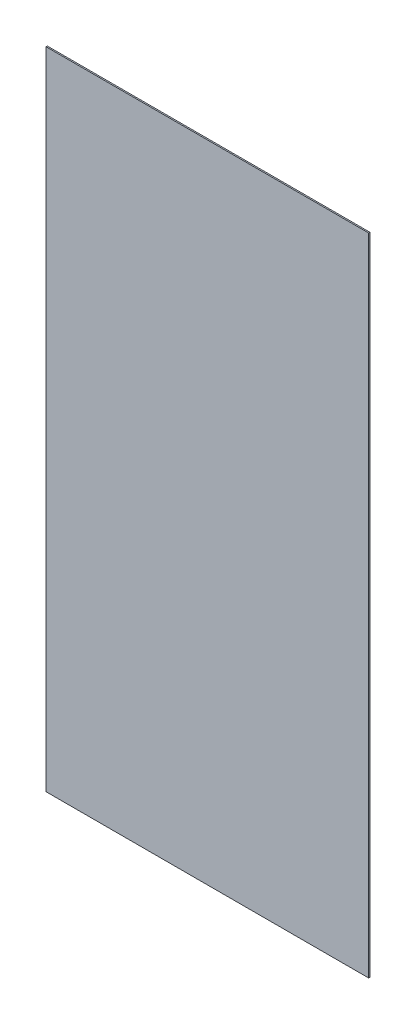
ISO-10303-21;
HEADER;
FILE_DESCRIPTION(('STEP AP214'),'2;1');
FILE_NAME('part.step','',(''),(''),'','','');
FILE_SCHEMA(('AUTOMOTIVE_DESIGN { 1 0 10303 214 1 1 1 1 }'));
ENDSEC;
DATA;
#1=APPLICATION_CONTEXT('core data for automotive mechanical design processes');
#2=APPLICATION_PROTOCOL_DEFINITION('international standard','automotive_design',2000,#1);
#3=PRODUCT_CONTEXT('',#1,'mechanical');
#4=PRODUCT('Part','Part','',(#3));
#5=PRODUCT_RELATED_PRODUCT_CATEGORY('part','',(#4));
#6=PRODUCT_DEFINITION_FORMATION('','',#4);
#7=PRODUCT_DEFINITION_CONTEXT('part definition',#1,'design');
#8=PRODUCT_DEFINITION('design','',#6,#7);
#9=PRODUCT_DEFINITION_SHAPE('','',#8);
#10=(LENGTH_UNIT() NAMED_UNIT(*) SI_UNIT(.MILLI.,.METRE.));
#11=(NAMED_UNIT(*) PLANE_ANGLE_UNIT() SI_UNIT($,.RADIAN.));
#12=(NAMED_UNIT(*) SI_UNIT($,.STERADIAN.) SOLID_ANGLE_UNIT());
#13=UNCERTAINTY_MEASURE_WITH_UNIT(LENGTH_MEASURE(1.E-05),#10,'distance_accuracy_value','');
#14=(GEOMETRIC_REPRESENTATION_CONTEXT(3) GLOBAL_UNCERTAINTY_ASSIGNED_CONTEXT((#13)) GLOBAL_UNIT_ASSIGNED_CONTEXT((#10,
#11,#12)) REPRESENTATION_CONTEXT('',''));
#15=CARTESIAN_POINT('',(0.,0.,0.));
#16=DIRECTION('',(0.,0.,1.));
#17=DIRECTION('',(1.,0.,0.));
#18=AXIS2_PLACEMENT_3D('',#15,#16,#17);
#19=CARTESIAN_POINT('',(1250.,2500.,10.));
#20=DIRECTION('',(-1.,0.,0.));
#21=DIRECTION('',(0.,-1.,0.));
#22=AXIS2_PLACEMENT_3D('',#19,#20,#21);
#23=PLANE('',#22);
#24=DIRECTION('',(0.,1.,0.));
#25=VECTOR('',#24,1.);
#26=CARTESIAN_POINT('',(1250.,2500.,0.));
#27=LINE('',#26,#25);
#28=CARTESIAN_POINT('',(1250.,-2500.,0.));
#29=VERTEX_POINT('',#28);
#30=CARTESIAN_POINT('',(1250.,2500.,0.));
#31=VERTEX_POINT('',#30);
#32=EDGE_CURVE('E107',#29,#31,#27,.T.);
#33=ORIENTED_EDGE('',*,*,#32,.T.);
#34=DIRECTION('',(0.,0.,-1.));
#35=VECTOR('',#34,1.);
#36=CARTESIAN_POINT('',(1250.,2500.,10.));
#37=LINE('',#36,#35);
#38=CARTESIAN_POINT('',(1250.,2500.,10.));
#39=VERTEX_POINT('',#38);
#40=EDGE_CURVE('E11',#39,#31,#37,.T.);
#41=ORIENTED_EDGE('',*,*,#40,.F.);
#42=DIRECTION('',(0.,1.,0.));
#43=VECTOR('',#42,1.);
#44=CARTESIAN_POINT('',(1250.,2500.,10.));
#45=LINE('',#44,#43);
#46=CARTESIAN_POINT('',(1250.,-2500.,10.));
#47=VERTEX_POINT('',#46);
#48=EDGE_CURVE('E91',#47,#39,#45,.T.);
#49=ORIENTED_EDGE('',*,*,#48,.F.);
#50=DIRECTION('',(0.,0.,-1.));
#51=VECTOR('',#50,1.);
#52=CARTESIAN_POINT('',(1250.,-2500.,10.));
#53=LINE('',#52,#51);
#54=EDGE_CURVE('E103',#47,#29,#53,.T.);
#55=ORIENTED_EDGE('',*,*,#54,.T.);
#56=EDGE_LOOP('',(#33,#41,#49,#55));
#57=FACE_BOUND('',#56,.T.);
#58=ADVANCED_FACE('F39',(#57),#23,.F.);
#59=CARTESIAN_POINT('',(-1250.,2500.,10.));
#60=DIRECTION('',(0.,-1.,0.));
#61=DIRECTION('',(0.,0.,-1.));
#62=AXIS2_PLACEMENT_3D('',#59,#60,#61);
#63=PLANE('',#62);
#64=DIRECTION('',(-1.,0.,0.));
#65=VECTOR('',#64,1.);
#66=CARTESIAN_POINT('',(-1250.,2500.,0.));
#67=LINE('',#66,#65);
#68=CARTESIAN_POINT('',(-1250.,2500.,0.));
#69=VERTEX_POINT('',#68);
#70=EDGE_CURVE('E96',#31,#69,#67,.T.);
#71=ORIENTED_EDGE('',*,*,#70,.T.);
#72=DIRECTION('',(0.,0.,-1.));
#73=VECTOR('',#72,1.);
#74=CARTESIAN_POINT('',(-1250.,2500.,10.));
#75=LINE('',#74,#73);
#76=CARTESIAN_POINT('',(-1250.,2500.,10.));
#77=VERTEX_POINT('',#76);
#78=EDGE_CURVE('E48',#77,#69,#75,.T.);
#79=ORIENTED_EDGE('',*,*,#78,.F.);
#80=DIRECTION('',(-1.,0.,0.));
#81=VECTOR('',#80,1.);
#82=CARTESIAN_POINT('',(-1250.,2500.,10.));
#83=LINE('',#82,#81);
#84=EDGE_CURVE('E86',#39,#77,#83,.T.);
#85=ORIENTED_EDGE('',*,*,#84,.F.);
#86=ORIENTED_EDGE('',*,*,#40,.T.);
#87=EDGE_LOOP('',(#71,#79,#85,#86));
#88=FACE_BOUND('',#87,.T.);
#89=ADVANCED_FACE('F95',(#88),#63,.F.);
#90=CARTESIAN_POINT('',(-1250.,2500.,10.));
#91=DIRECTION('',(1.,0.,0.));
#92=DIRECTION('',(0.,1.,0.));
#93=AXIS2_PLACEMENT_3D('',#90,#91,#92);
#94=PLANE('',#93);
#95=DIRECTION('',(0.,-1.,0.));
#96=VECTOR('',#95,1.);
#97=CARTESIAN_POINT('',(-1250.,2500.,0.));
#98=LINE('',#97,#96);
#99=CARTESIAN_POINT('',(-1250.,-2500.,0.));
#100=VERTEX_POINT('',#99);
#101=EDGE_CURVE('E73',#69,#100,#98,.T.);
#102=ORIENTED_EDGE('',*,*,#101,.T.);
#103=DIRECTION('',(0.,0.,-1.));
#104=VECTOR('',#103,1.);
#105=CARTESIAN_POINT('',(-1250.,-2500.,10.));
#106=LINE('',#105,#104);
#107=CARTESIAN_POINT('',(-1250.,-2500.,10.));
#108=VERTEX_POINT('',#107);
#109=EDGE_CURVE('E98',#108,#100,#106,.T.);
#110=ORIENTED_EDGE('',*,*,#109,.F.);
#111=DIRECTION('',(0.,-1.,0.));
#112=VECTOR('',#111,1.);
#113=CARTESIAN_POINT('',(-1250.,2500.,10.));
#114=LINE('',#113,#112);
#115=EDGE_CURVE('E89',#77,#108,#114,.T.);
#116=ORIENTED_EDGE('',*,*,#115,.F.);
#117=ORIENTED_EDGE('',*,*,#78,.T.);
#118=EDGE_LOOP('',(#102,#110,#116,#117));
#119=FACE_BOUND('',#118,.T.);
#120=ADVANCED_FACE('F99',(#119),#94,.F.);
#121=CARTESIAN_POINT('',(-1250.,-2500.,10.));
#122=DIRECTION('',(0.,1.,0.));
#123=DIRECTION('',(0.,0.,1.));
#124=AXIS2_PLACEMENT_3D('',#121,#122,#123);
#125=PLANE('',#124);
#126=DIRECTION('',(1.,0.,0.));
#127=VECTOR('',#126,1.);
#128=CARTESIAN_POINT('',(-1250.,-2500.,0.));
#129=LINE('',#128,#127);
#130=EDGE_CURVE('E79',#100,#29,#129,.T.);
#131=ORIENTED_EDGE('',*,*,#130,.T.);
#132=ORIENTED_EDGE('',*,*,#54,.F.);
#133=DIRECTION('',(1.,0.,0.));
#134=VECTOR('',#133,1.);
#135=CARTESIAN_POINT('',(-1250.,-2500.,10.));
#136=LINE('',#135,#134);
#137=EDGE_CURVE('E56',#108,#47,#136,.T.);
#138=ORIENTED_EDGE('',*,*,#137,.F.);
#139=ORIENTED_EDGE('',*,*,#109,.T.);
#140=EDGE_LOOP('',(#131,#132,#138,#139));
#141=FACE_BOUND('',#140,.T.);
#142=ADVANCED_FACE('F120',(#141),#125,.F.);
#143=CARTESIAN_POINT('',(0.,0.,10.));
#144=DIRECTION('',(0.,0.,1.));
#145=DIRECTION('',(1.,0.,0.));
#146=AXIS2_PLACEMENT_3D('',#143,#144,#145);
#147=PLANE('',#146);
#148=ORIENTED_EDGE('',*,*,#48,.T.);
#149=ORIENTED_EDGE('',*,*,#84,.T.);
#150=ORIENTED_EDGE('',*,*,#115,.T.);
#151=ORIENTED_EDGE('',*,*,#137,.T.);
#152=EDGE_LOOP('',(#148,#149,#150,#151));
#153=FACE_BOUND('',#152,.T.);
#154=ADVANCED_FACE('F87',(#153),#147,.T.);
#155=CARTESIAN_POINT('',(0.,0.,0.));
#156=DIRECTION('',(0.,0.,1.));
#157=DIRECTION('',(1.,0.,0.));
#158=AXIS2_PLACEMENT_3D('',#155,#156,#157);
#159=PLANE('',#158);
#160=ORIENTED_EDGE('',*,*,#32,.F.);
#161=ORIENTED_EDGE('',*,*,#130,.F.);
#162=ORIENTED_EDGE('',*,*,#101,.F.);
#163=ORIENTED_EDGE('',*,*,#70,.F.);
#164=EDGE_LOOP('',(#160,#161,#162,#163));
#165=FACE_BOUND('',#164,.T.);
#166=ADVANCED_FACE('F123',(#165),#159,.F.);
#167=CLOSED_SHELL('',(#58,#89,#120,#142,#154,#166));
#168=MANIFOLD_SOLID_BREP('B2',#167);
#169=ADVANCED_BREP_SHAPE_REPRESENTATION('',(#18,#168),#14);
#170=SHAPE_DEFINITION_REPRESENTATION(#9,#169);
ENDSEC;
END-ISO-10303-21;
